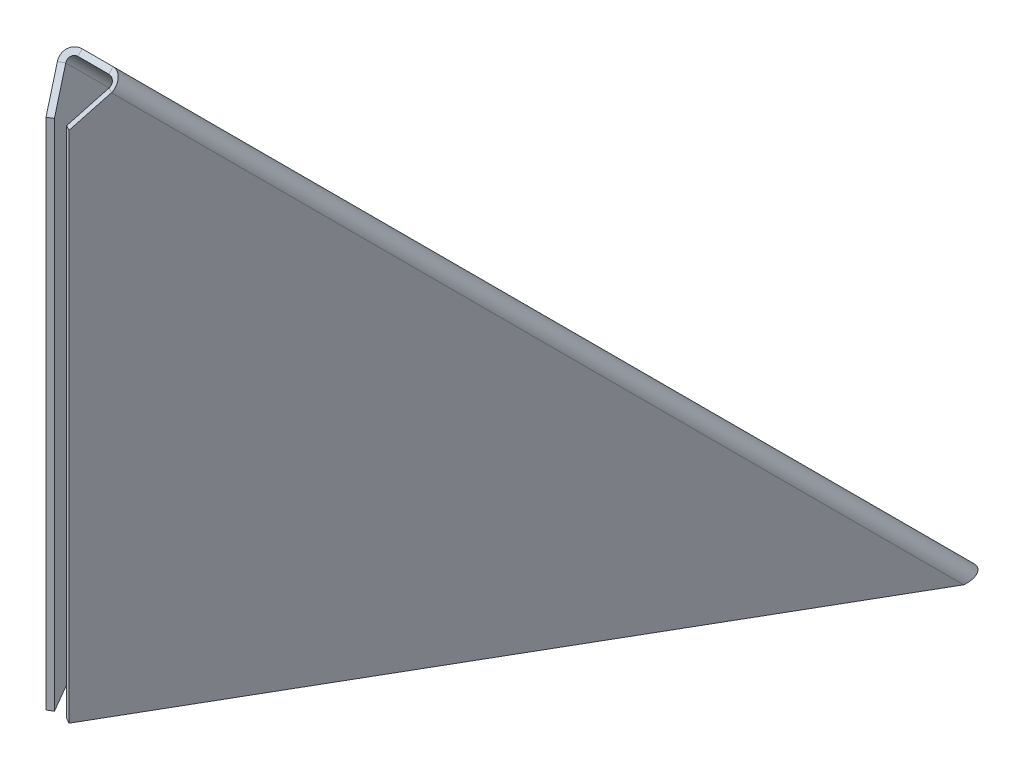
ISO-10303-21;
HEADER;
FILE_DESCRIPTION(('STEP AP214'),'2;1');
FILE_NAME('part.step','',(''),(''),'','','');
FILE_SCHEMA(('AUTOMOTIVE_DESIGN { 1 0 10303 214 1 1 1 1 }'));
ENDSEC;
DATA;
#1=APPLICATION_CONTEXT('core data for automotive mechanical design processes');
#2=APPLICATION_PROTOCOL_DEFINITION('international standard','automotive_design',2000,#1);
#3=PRODUCT_CONTEXT('',#1,'mechanical');
#4=PRODUCT('Part','Part','',(#3));
#5=PRODUCT_RELATED_PRODUCT_CATEGORY('part','',(#4));
#6=PRODUCT_DEFINITION_FORMATION('','',#4);
#7=PRODUCT_DEFINITION_CONTEXT('part definition',#1,'design');
#8=PRODUCT_DEFINITION('design','',#6,#7);
#9=PRODUCT_DEFINITION_SHAPE('','',#8);
#10=(LENGTH_UNIT() NAMED_UNIT(*) SI_UNIT(.MILLI.,.METRE.));
#11=(NAMED_UNIT(*) PLANE_ANGLE_UNIT() SI_UNIT($,.RADIAN.));
#12=(NAMED_UNIT(*) SI_UNIT($,.STERADIAN.) SOLID_ANGLE_UNIT());
#13=UNCERTAINTY_MEASURE_WITH_UNIT(LENGTH_MEASURE(1.E-05),#10,'distance_accuracy_value','');
#14=(GEOMETRIC_REPRESENTATION_CONTEXT(3) GLOBAL_UNCERTAINTY_ASSIGNED_CONTEXT((#13)) GLOBAL_UNIT_ASSIGNED_CONTEXT((#10,
#11,#12)) REPRESENTATION_CONTEXT('',''));
#15=CARTESIAN_POINT('',(0.,0.,0.));
#16=DIRECTION('',(0.,0.,1.));
#17=DIRECTION('',(1.,0.,0.));
#18=AXIS2_PLACEMENT_3D('',#15,#16,#17);
#19=CARTESIAN_POINT('',(0.,0.,0.));
#20=DIRECTION('',(0.,0.707106781186549,0.707106781186546));
#21=DIRECTION('',(1.,0.,0.));
#22=AXIS2_PLACEMENT_3D('',#19,#20,#21);
#23=PLANE('',#22);
#24=DIRECTION('',(0.,0.707106781186546,-0.707106781186549));
#25=VECTOR('',#24,1.);
#26=CARTESIAN_POINT('',(53.8626770133606,0.,0.));
#27=LINE('',#26,#25);
#28=CARTESIAN_POINT('',(53.8626770133606,0.,0.));
#29=VERTEX_POINT('',#28);
#30=CARTESIAN_POINT('',(53.8626770133606,0.70710678118654,-0.707106781186554));
#31=VERTEX_POINT('',#30);
#32=EDGE_CURVE('E11',#29,#31,#27,.T.);
#33=ORIENTED_EDGE('',*,*,#32,.F.);
#34=DIRECTION('',(1.,0.,0.));
#35=VECTOR('',#34,1.);
#36=CARTESIAN_POINT('',(0.,0.,0.));
#37=LINE('',#36,#35);
#38=CARTESIAN_POINT('',(-53.8626770133606,0.,0.));
#39=VERTEX_POINT('',#38);
#40=EDGE_CURVE('E141',#39,#29,#37,.T.);
#41=ORIENTED_EDGE('',*,*,#40,.F.);
#42=DIRECTION('',(0.,0.707106781186547,-0.707106781186547));
#43=VECTOR('',#42,1.);
#44=CARTESIAN_POINT('',(-53.8626770133606,0.,0.));
#45=LINE('',#44,#43);
#46=CARTESIAN_POINT('',(-53.8626770133606,0.707106781186546,-0.707106781186549));
#47=VERTEX_POINT('',#46);
#48=EDGE_CURVE('E51',#39,#47,#45,.T.);
#49=ORIENTED_EDGE('',*,*,#48,.T.);
#50=DIRECTION('',(1.,0.,0.));
#51=VECTOR('',#50,1.);
#52=CARTESIAN_POINT('',(0.,0.707106781186546,-0.707106781186549));
#53=LINE('',#52,#51);
#54=EDGE_CURVE('E138',#47,#31,#53,.T.);
#55=ORIENTED_EDGE('',*,*,#54,.T.);
#56=EDGE_LOOP('',(#33,#41,#49,#55));
#57=FACE_BOUND('',#56,.T.);
#58=ADVANCED_FACE('F39',(#57),#23,.F.);
#59=CARTESIAN_POINT('',(-54.2181913387227,0.,0.0913379068407981));
#60=CARTESIAN_POINT('',(-54.3273002838407,0.251976315339486,-0.0976443296638165));
#61=CARTESIAN_POINT('',(-54.4364092289587,0.50395263067897,-0.286626566168431));
#62=CARTESIAN_POINT('',(-54.5455181740767,0.755928946018455,-0.475608802673046));
#63=CARTESIAN_POINT('',(-55.9502421462916,0.,1.09133790684079));
#64=CARTESIAN_POINT('',(-56.6367013605992,0.251976315339486,1.23568900366951));
#65=CARTESIAN_POINT('',(-57.3231605749069,0.503952630678971,1.38004010049823));
#66=CARTESIAN_POINT('',(-58.0096197892145,0.755928946018456,1.52439119732694));
#67=CARTESIAN_POINT('',(-54.4227169146397,0.,3.73708921790538));
#68=CARTESIAN_POINT('',(-54.8909582387113,-0.251976315339482,4.25940478774333));
#69=CARTESIAN_POINT('',(-55.3591995627829,-0.503952630678966,4.78172035758127));
#70=CARTESIAN_POINT('',(-55.8274408868546,-0.75592894601845,5.30403592741922));
#71=CARTESIAN_POINT('',(-52.6906661070708,0.,2.73708921790539));
#72=CARTESIAN_POINT('',(-52.5815571619528,-0.251976315339483,2.92607145441));
#73=CARTESIAN_POINT('',(-52.4724482168348,-0.503952630678967,3.11505369091461));
#74=CARTESIAN_POINT('',(-52.3633392717168,-0.755928946018451,3.30403592741923));
#75=CARTESIAN_POINT('',(-50.9586152995019,0.,1.73708921790539));
#76=CARTESIAN_POINT('',(-50.2721560851943,-0.251976315339483,1.59273812107667));
#77=CARTESIAN_POINT('',(-49.5856968708867,-0.503952630678968,1.44838702424796));
#78=CARTESIAN_POINT('',(-48.8992376565791,-0.755928946018453,1.30403592741924));
#79=CARTESIAN_POINT('',(-52.4861405311539,0.,-0.908662093159197));
#80=CARTESIAN_POINT('',(-52.0178992070822,0.251976315339486,-1.43097766299714));
#81=CARTESIAN_POINT('',(-51.5496578830106,0.50395263067897,-1.95329323283509));
#82=CARTESIAN_POINT('',(-51.081416558939,0.755928946018454,-2.47560880267303));
#83=CARTESIAN_POINT('',(-54.2181913387227,0.,0.0913379068407981));
#84=CARTESIAN_POINT('',(-54.3273002838407,0.251976315339486,-0.0976443296638165));
#85=CARTESIAN_POINT('',(-54.4364092289587,0.50395263067897,-0.286626566168431));
#86=CARTESIAN_POINT('',(-54.5455181740767,0.755928946018455,-0.475608802673046));
#87=(BOUNDED_SURFACE() B_SPLINE_SURFACE(3,3,((#59,#60,#61,#62),(#63,#64,#65,#66),(#67,#68,#69,
#70),(#71,#72,#73,#74),(#75,#76,#77,#78),(#79,#80,#81,#82),(#83,#84,#85,#86)),.UNSPECIFIED.,.T.,
.F.,.F.) B_SPLINE_SURFACE_WITH_KNOTS((4,3,4),(4,4),(0.,0.5,1.),(0.,1.),
.UNSPECIFIED.) GEOMETRIC_REPRESENTATION_ITEM() RATIONAL_B_SPLINE_SURFACE(((1.,1.,1.,1.),
(0.333333333333333,0.333333333333333,0.333333333333333,0.333333333333333),(0.333333333333333,
0.333333333333333,0.333333333333333,0.333333333333333),(1.,1.,1.,1.),(0.333333333333333,
0.333333333333333,0.333333333333333,0.333333333333333),(0.333333333333333,0.333333333333333,
0.333333333333333,0.333333333333333),(1.,1.,1.,1.))) REPRESENTATION_ITEM('') SURFACE());
#88=CARTESIAN_POINT('',(-53.4544287228968,0.,1.41421356237309));
#89=DIRECTION('',(0.,1.,0.));
#90=DIRECTION('',(-0.499999999999998,0.,-0.86602540378444));
#91=AXIS2_PLACEMENT_3D('',#88,#89,#90);
#92=ELLIPSE('',#91,1.52752523165194,1.);
#93=CARTESIAN_POINT('',(-54.3204541266812,0.,1.91421356237308));
#94=VERTEX_POINT('',#93);
#95=EDGE_CURVE('E205',#39,#94,#92,.T.);
#96=DIRECTION('',(-0.86602540378444,0.,0.499999999999998));
#97=VECTOR('',#96,1.);
#98=CARTESIAN_POINT('',(-54.3204541266812,0.,1.91421356237308));
#99=LINE('',#98,#97);
#100=CARTESIAN_POINT('',(-55.1864795304657,0.,2.41421356237307));
#101=VERTEX_POINT('',#100);
#102=EDGE_CURVE('E146',#94,#101,#99,.T.);
#103=CARTESIAN_POINT('',(-53.4544287228968,0.,1.41421356237309));
#104=DIRECTION('',(0.163663417676993,0.944911182523068,0.283473354756921));
#105=DIRECTION('',(-0.472455591261531,0.327326835353988,-0.818317088384973));
#106=AXIS2_PLACEMENT_3D('',#103,#104,#105);
#107=ELLIPSE('',#106,2.3094010767585,2.);
#108=EDGE_CURVE('E160',#47,#101,#107,.T.);
#109=ORIENTED_EDGE('',*,*,#48,.F.);
#110=ORIENTED_EDGE('',*,*,#95,.T.);
#111=ORIENTED_EDGE('',*,*,#102,.T.);
#112=ORIENTED_EDGE('',*,*,#108,.F.);
#113=EDGE_LOOP('',(#109,#110,#111,#112));
#114=FACE_BOUND('',#113,.T.);
#115=ADVANCED_FACE('F161',(#114),#87,.T.);
#116=CARTESIAN_POINT('',(0.,0.,96.));
#117=DIRECTION('',(0.,1.,0.));
#118=DIRECTION('',(0.499999999999998,0.,0.86602540378444));
#119=AXIS2_PLACEMENT_3D('',#116,#117,#118);
#120=PLANE('',#119);
#121=ORIENTED_EDGE('',*,*,#102,.F.);
#122=DIRECTION('',(0.499999999999998,0.,0.86602540378444));
#123=VECTOR('',#122,1.);
#124=CARTESIAN_POINT('',(0.,0.,96.));
#125=LINE('',#124,#123);
#126=CARTESIAN_POINT('',(-0.999999999999983,0.,94.2679491924311));
#127=VERTEX_POINT('',#126);
#128=EDGE_CURVE('E210',#94,#127,#125,.T.);
#129=ORIENTED_EDGE('',*,*,#128,.T.);
#130=DIRECTION('',(-0.86602540378444,0.,0.499999999999998));
#131=VECTOR('',#130,1.);
#132=CARTESIAN_POINT('',(-0.999999999999983,0.,94.2679491924311));
#133=LINE('',#132,#131);
#134=CARTESIAN_POINT('',(-1.86602540378442,-1.11022302462516E-13,94.7679491924311));
#135=VERTEX_POINT('',#134);
#136=EDGE_CURVE('E255',#127,#135,#133,.T.);
#137=ORIENTED_EDGE('',*,*,#136,.T.);
#138=DIRECTION('',(-0.499999999999998,0.,-0.86602540378444));
#139=VECTOR('',#138,1.);
#140=CARTESIAN_POINT('',(-0.866025403784423,-1.11022302462516E-13,96.5));
#141=LINE('',#140,#139);
#142=EDGE_CURVE('E188',#101,#135,#141,.F.);
#143=ORIENTED_EDGE('',*,*,#142,.F.);
#144=EDGE_LOOP('',(#121,#129,#137,#143));
#145=FACE_BOUND('',#144,.T.);
#146=ADVANCED_FACE('F258',(#145),#120,.F.);
#147=CARTESIAN_POINT('',(-0.999999999999983,225.013062293819,94.2679491924311));
#148=DIRECTION('',(-0.499999999999998,0.,-0.86602540378444));
#149=DIRECTION('',(0.,1.,0.));
#150=AXIS2_PLACEMENT_3D('',#147,#148,#149);
#151=PLANE('',#150);
#152=ORIENTED_EDGE('',*,*,#136,.F.);
#153=DIRECTION('',(0.,1.,0.));
#154=VECTOR('',#153,1.);
#155=CARTESIAN_POINT('',(-0.999999999999983,225.013062293819,94.2679491924311));
#156=LINE('',#155,#154);
#157=CARTESIAN_POINT('',(-0.99999999999999,83.5899151838382,94.2679491924311));
#158=VERTEX_POINT('',#157);
#159=EDGE_CURVE('E221',#127,#158,#156,.T.);
#160=ORIENTED_EDGE('',*,*,#159,.T.);
#161=DIRECTION('',(-0.86602540378444,0.,0.499999999999998));
#162=VECTOR('',#161,1.);
#163=CARTESIAN_POINT('',(-0.99999999999999,83.5899151838382,94.2679491924311));
#164=LINE('',#163,#162);
#165=CARTESIAN_POINT('',(-1.86602540378443,83.5899151838382,94.7679491924311));
#166=VERTEX_POINT('',#165);
#167=EDGE_CURVE('E253',#158,#166,#164,.T.);
#168=ORIENTED_EDGE('',*,*,#167,.T.);
#169=DIRECTION('',(0.,1.,0.));
#170=VECTOR('',#169,1.);
#171=CARTESIAN_POINT('',(-1.86602540378442,225.013062293819,94.7679491924311));
#172=LINE('',#171,#170);
#173=EDGE_CURVE('E172',#135,#166,#172,.T.);
#174=ORIENTED_EDGE('',*,*,#173,.F.);
#175=EDGE_LOOP('',(#152,#160,#168,#174));
#176=FACE_BOUND('',#175,.T.);
#177=ADVANCED_FACE('F266',(#176),#151,.F.);
#178=CARTESIAN_POINT('',(19.6718516136796,47.7852179024205,130.072646473849));
#179=DIRECTION('',(0.327326835353987,0.755928946018455,0.566946709513841));
#180=DIRECTION('',(0.377964473009226,-0.654653670707977,0.654653670707979));
#181=AXIS2_PLACEMENT_3D('',#178,#179,#180);
#182=PLANE('',#181);
#183=ORIENTED_EDGE('',*,*,#167,.F.);
#184=DIRECTION('',(0.377964473009226,-0.654653670707977,0.654653670707979));
#185=VECTOR('',#184,1.);
#186=CARTESIAN_POINT('',(19.6718516136796,47.7852179024205,130.072646473849));
#187=LINE('',#186,#185);
#188=CARTESIAN_POINT('',(-3.52989704687734,87.9718254069483,89.886038969321));
#189=VERTEX_POINT('',#188);
#190=EDGE_CURVE('E207',#189,#158,#187,.T.);
#191=ORIENTED_EDGE('',*,*,#190,.F.);
#192=DIRECTION('',(-0.866025403784453,0.,0.499999999999975));
#193=VECTOR('',#192,1.);
#194=CARTESIAN_POINT('',(-3.52989704687734,87.9718254069483,89.886038969321));
#195=LINE('',#194,#193);
#196=CARTESIAN_POINT('',(-4.39592245066177,87.9718254069482,90.386038969321));
#197=VERTEX_POINT('',#196);
#198=EDGE_CURVE('E251',#189,#197,#195,.T.);
#199=ORIENTED_EDGE('',*,*,#198,.T.);
#200=DIRECTION('',(0.377964473009226,-0.654653670707977,0.654653670707979));
#201=VECTOR('',#200,1.);
#202=CARTESIAN_POINT('',(18.8058262098951,47.7852179024205,130.572646473849));
#203=LINE('',#202,#201);
#204=EDGE_CURVE('E156',#197,#166,#203,.T.);
#205=ORIENTED_EDGE('',*,*,#204,.T.);
#206=EDGE_LOOP('',(#183,#191,#199,#205));
#207=FACE_BOUND('',#206,.T.);
#208=ADVANCED_FACE('F269',(#207),#182,.T.);
#209=CARTESIAN_POINT('',(-4.52547762530268,88.4890866488607,89.9033002112335));
#210=CARTESIAN_POINT('',(-4.21687092537849,88.3999995682232,89.814213130596));
#211=CARTESIAN_POINT('',(-3.90826422545431,88.3109124875857,89.7251260499585));
#212=CARTESIAN_POINT('',(-3.59965752553012,88.2218254069483,89.636038969321));
#213=CARTESIAN_POINT('',(-4.52547762530268,91.3175137736069,87.0748730864873));
#214=CARTESIAN_POINT('',(-4.21687092537849,90.7570221721784,87.4571905266409));
#215=CARTESIAN_POINT('',(-3.90826422545431,90.1965305707499,87.8395079667944));
#216=CARTESIAN_POINT('',(-3.59965752553013,89.6360389693213,88.2218254069479));
#217=CARTESIAN_POINT('',(-0.513590526288294,90.782991289782,86.5403506026624));
#218=CARTESIAN_POINT('',(-0.822197226212478,90.4006738496285,87.100842204091));
#219=CARTESIAN_POINT('',(-1.13080392613666,90.0183564094749,87.6613338055195));
#220=CARTESIAN_POINT('',(-1.43941062606084,89.6360389693213,88.2218254069479));
#221=CARTESIAN_POINT('',(-0.513590526288294,87.9545641650358,89.3687777274086));
#222=CARTESIAN_POINT('',(-0.822197226212477,88.0436512456733,89.4578648080461));
#223=CARTESIAN_POINT('',(-1.13080392613666,88.1327383263108,89.5469518886836));
#224=CARTESIAN_POINT('',(-1.43941062606085,88.2218254069483,89.636038969321));
#225=CARTESIAN_POINT('',(-0.513590526288293,85.1261370402896,92.1972048521548));
#226=CARTESIAN_POINT('',(-0.822197226212478,85.6866286417182,91.8148874120013));
#227=CARTESIAN_POINT('',(-1.13080392613666,86.2471202431467,91.4325699718477));
#228=CARTESIAN_POINT('',(-1.43941062606085,86.8076118445752,91.0502525316941));
#229=CARTESIAN_POINT('',(-4.52547762530267,85.6606595241145,92.7317273359797));
#230=CARTESIAN_POINT('',(-4.21687092537849,86.0429769642681,92.1712357345512));
#231=CARTESIAN_POINT('',(-3.90826422545431,86.4252944044216,91.6107441331227));
#232=CARTESIAN_POINT('',(-3.59965752553013,86.8076118445752,91.0502525316941));
#233=CARTESIAN_POINT('',(-4.52547762530268,88.4890866488607,89.9033002112335));
#234=CARTESIAN_POINT('',(-4.21687092537849,88.3999995682232,89.814213130596));
#235=CARTESIAN_POINT('',(-3.90826422545431,88.3109124875857,89.7251260499585));
#236=CARTESIAN_POINT('',(-3.59965752553012,88.2218254069483,89.636038969321));
#237=(BOUNDED_SURFACE() B_SPLINE_SURFACE(3,3,((#209,#210,#211,#212),(#213,#214,#215,#216),(#217,
#218,#219,#220),(#221,#222,#223,#224),(#225,#226,#227,#228),(#229,#230,#231,#232),(#233,#234,
#235,#236)),.UNSPECIFIED.,.T.,.F.,.F.) B_SPLINE_SURFACE_WITH_KNOTS((4,3,4),(4,4),(0.,0.5,1.),
(0.,1.),.UNSPECIFIED.) GEOMETRIC_REPRESENTATION_ITEM() RATIONAL_B_SPLINE_SURFACE(((1.,1.,1.,1.),
(0.333333333333333,0.333333333333333,0.333333333333333,0.333333333333333),(0.333333333333333,
0.333333333333333,0.333333333333333,0.333333333333333),(1.,1.,1.,1.),(0.333333333333333,
0.333333333333333,0.333333333333333,0.333333333333333),(0.333333333333333,0.333333333333333,
0.333333333333333,0.333333333333333),(1.,1.,1.,1.))) REPRESENTATION_ITEM('') SURFACE());
#238=CARTESIAN_POINT('',(-2.51953407579548,88.2218254069483,89.636038969321));
#239=DIRECTION('',(0.,0.707106781186549,0.707106781186546));
#240=DIRECTION('',(-1.,0.,0.));
#241=AXIS2_PLACEMENT_3D('',#238,#239,#240);
#242=ELLIPSE('',#241,1.08012344973464,1.);
#243=CARTESIAN_POINT('',(-2.51953407579548,88.9289321881348,88.9289321881345));
#244=VERTEX_POINT('',#243);
#245=EDGE_CURVE('E231',#189,#244,#242,.F.);
#246=DIRECTION('',(0.,0.707106781186546,-0.707106781186549));
#247=VECTOR('',#246,1.);
#248=CARTESIAN_POINT('',(-2.51953407579548,88.9289321881348,88.9289321881345));
#249=LINE('',#248,#247);
#250=CARTESIAN_POINT('',(-2.51953407579548,89.6360389693214,88.221825406948));
#251=VERTEX_POINT('',#250);
#252=EDGE_CURVE('E249',#244,#251,#249,.T.);
#253=CARTESIAN_POINT('',(-2.51953407579548,88.2218254069483,89.636038969321));
#254=DIRECTION('',(0.185164019954511,0.694879228972304,0.694879228972302));
#255=DIRECTION('',(-0.982707629823991,0.130930734141596,0.130930734141596));
#256=AXIS2_PLACEMENT_3D('',#253,#254,#255);
#257=ELLIPSE('',#256,2.04124145231931,2.);
#258=EDGE_CURVE('E165',#197,#251,#257,.F.);
#259=ORIENTED_EDGE('',*,*,#198,.F.);
#260=ORIENTED_EDGE('',*,*,#245,.T.);
#261=ORIENTED_EDGE('',*,*,#252,.T.);
#262=ORIENTED_EDGE('',*,*,#258,.F.);
#263=EDGE_LOOP('',(#259,#260,#261,#262));
#264=FACE_BOUND('',#263,.T.);
#265=ADVANCED_FACE('F271',(#264),#237,.F.);
#266=CARTESIAN_POINT('',(-4.08248290463858,88.9289321881348,88.9289321881345));
#267=DIRECTION('',(0.,-0.707106781186549,-0.707106781186546));
#268=DIRECTION('',(-1.,0.,0.));
#269=AXIS2_PLACEMENT_3D('',#266,#267,#268);
#270=PLANE('',#269);
#271=ORIENTED_EDGE('',*,*,#252,.F.);
#272=DIRECTION('',(-1.,0.,0.));
#273=VECTOR('',#272,1.);
#274=CARTESIAN_POINT('',(-4.08248290463858,88.9289321881348,88.9289321881345));
#275=LINE('',#274,#273);
#276=CARTESIAN_POINT('',(2.5195340757955,88.9289321881348,88.9289321881345));
#277=VERTEX_POINT('',#276);
#278=EDGE_CURVE('E202',#277,#244,#275,.T.);
#279=ORIENTED_EDGE('',*,*,#278,.F.);
#280=DIRECTION('',(0.,0.707106781186513,-0.707106781186582));
#281=VECTOR('',#280,1.);
#282=CARTESIAN_POINT('',(2.5195340757955,88.9289321881348,88.9289321881345));
#283=LINE('',#282,#281);
#284=CARTESIAN_POINT('',(2.5195340757955,89.6360389693214,88.221825406948));
#285=VERTEX_POINT('',#284);
#286=EDGE_CURVE('E247',#277,#285,#283,.T.);
#287=ORIENTED_EDGE('',*,*,#286,.T.);
#288=DIRECTION('',(1.,0.,0.));
#289=VECTOR('',#288,1.);
#290=CARTESIAN_POINT('',(0.,89.6360389693214,88.221825406948));
#291=LINE('',#290,#289);
#292=EDGE_CURVE('E157',#285,#251,#291,.F.);
#293=ORIENTED_EDGE('',*,*,#292,.T.);
#294=EDGE_LOOP('',(#271,#279,#287,#293));
#295=FACE_BOUND('',#294,.T.);
#296=ADVANCED_FACE('F276',(#295),#270,.F.);
#297=CARTESIAN_POINT('',(0.513590526288311,87.9545641650358,89.3687777274086));
#298=CARTESIAN_POINT('',(0.822197226212496,88.0436512456733,89.4578648080461));
#299=CARTESIAN_POINT('',(1.13080392613668,88.1327383263108,89.5469518886836));
#300=CARTESIAN_POINT('',(1.43941062606086,88.2218254069482,89.636038969321));
#301=CARTESIAN_POINT('',(0.513590526288303,90.782991289782,86.5403506026624));
#302=CARTESIAN_POINT('',(0.82219722621249,90.4006738496285,87.100842204091));
#303=CARTESIAN_POINT('',(1.13080392613668,90.0183564094749,87.6613338055195));
#304=CARTESIAN_POINT('',(1.43941062606086,89.6360389693213,88.2218254069479));
#305=CARTESIAN_POINT('',(4.52547762530269,91.3175137736068,87.0748730864873));
#306=CARTESIAN_POINT('',(4.21687092537851,90.7570221721784,87.4571905266409));
#307=CARTESIAN_POINT('',(3.90826422545433,90.1965305707499,87.8395079667944));
#308=CARTESIAN_POINT('',(3.59965752553015,89.6360389693213,88.2218254069479));
#309=CARTESIAN_POINT('',(4.5254776253027,88.4890866488607,89.9033002112335));
#310=CARTESIAN_POINT('',(4.21687092537852,88.3999995682232,89.814213130596));
#311=CARTESIAN_POINT('',(3.90826422545433,88.3109124875857,89.7251260499585));
#312=CARTESIAN_POINT('',(3.59965752553015,88.2218254069482,89.636038969321));
#313=CARTESIAN_POINT('',(4.52547762530271,85.6606595241145,92.7317273359797));
#314=CARTESIAN_POINT('',(4.21687092537852,86.0429769642681,92.1712357345512));
#315=CARTESIAN_POINT('',(3.90826422545434,86.4252944044216,91.6107441331227));
#316=CARTESIAN_POINT('',(3.59965752553015,86.8076118445751,91.0502525316941));
#317=CARTESIAN_POINT('',(0.51359052628832,85.1261370402896,92.1972048521548));
#318=CARTESIAN_POINT('',(0.822197226212502,85.6866286417182,91.8148874120013));
#319=CARTESIAN_POINT('',(1.13080392613668,86.2471202431467,91.4325699718477));
#320=CARTESIAN_POINT('',(1.43941062606086,86.8076118445751,91.0502525316941));
#321=CARTESIAN_POINT('',(0.513590526288311,87.9545641650358,89.3687777274086));
#322=CARTESIAN_POINT('',(0.822197226212496,88.0436512456733,89.4578648080461));
#323=CARTESIAN_POINT('',(1.13080392613668,88.1327383263108,89.5469518886836));
#324=CARTESIAN_POINT('',(1.43941062606086,88.2218254069482,89.636038969321));
#325=(BOUNDED_SURFACE() B_SPLINE_SURFACE(3,3,((#297,#298,#299,#300),(#301,#302,#303,#304),(#305,
#306,#307,#308),(#309,#310,#311,#312),(#313,#314,#315,#316),(#317,#318,#319,#320),(#321,#322,
#323,#324)),.UNSPECIFIED.,.T.,.F.,.F.) B_SPLINE_SURFACE_WITH_KNOTS((4,3,4),(4,4),(0.,0.5,1.),
(0.,1.),.UNSPECIFIED.) GEOMETRIC_REPRESENTATION_ITEM() RATIONAL_B_SPLINE_SURFACE(((1.,1.,1.,1.),
(0.333333333333333,0.333333333333333,0.333333333333333,0.333333333333333),(0.333333333333333,
0.333333333333333,0.333333333333333,0.333333333333333),(1.,1.,1.,1.),(0.333333333333333,
0.333333333333333,0.333333333333333,0.333333333333333),(0.333333333333333,0.333333333333333,
0.333333333333333,0.333333333333333),(1.,1.,1.,1.))) REPRESENTATION_ITEM('') SURFACE());
#326=CARTESIAN_POINT('',(2.51953407579551,88.2218254069482,89.636038969321));
#327=DIRECTION('',(0.,0.707106781186549,0.707106781186546));
#328=DIRECTION('',(-1.,0.,0.));
#329=AXIS2_PLACEMENT_3D('',#326,#327,#328);
#330=ELLIPSE('',#329,1.08012344973464,1.);
#331=CARTESIAN_POINT('',(3.52989704687736,87.9718254069483,89.886038969321));
#332=VERTEX_POINT('',#331);
#333=EDGE_CURVE('E234',#277,#332,#330,.F.);
#334=DIRECTION('',(0.86602540378444,0.,0.499999999999998));
#335=VECTOR('',#334,1.);
#336=CARTESIAN_POINT('',(3.52989704687736,87.9718254069483,89.886038969321));
#337=LINE('',#336,#335);
#338=CARTESIAN_POINT('',(4.39592245066177,87.9718254069483,90.386038969321));
#339=VERTEX_POINT('',#338);
#340=EDGE_CURVE('E101',#332,#339,#337,.T.);
#341=CARTESIAN_POINT('',(2.51953407579551,88.2218254069482,89.636038969321));
#342=DIRECTION('',(-0.185164019954509,0.694879228972305,0.694879228972302));
#343=DIRECTION('',(-0.982707629823991,-0.130930734141596,-0.130930734141593));
#344=AXIS2_PLACEMENT_3D('',#341,#342,#343);
#345=ELLIPSE('',#344,2.04124145231931,2.);
#346=EDGE_CURVE('E189',#285,#339,#345,.F.);
#347=ORIENTED_EDGE('',*,*,#286,.F.);
#348=ORIENTED_EDGE('',*,*,#333,.T.);
#349=ORIENTED_EDGE('',*,*,#340,.T.);
#350=ORIENTED_EDGE('',*,*,#346,.F.);
#351=EDGE_LOOP('',(#347,#348,#349,#350));
#352=FACE_BOUND('',#351,.T.);
#353=ADVANCED_FACE('F288',(#352),#325,.F.);
#354=CARTESIAN_POINT('',(-20.8382753007191,45.7649128133161,132.092951562953));
#355=DIRECTION('',(-0.327326835353987,0.755928946018455,0.566946709513841));
#356=DIRECTION('',(0.377964473009226,0.654653670707977,-0.654653670707979));
#357=AXIS2_PLACEMENT_3D('',#354,#355,#356);
#358=PLANE('',#357);
#359=ORIENTED_EDGE('',*,*,#340,.F.);
#360=DIRECTION('',(0.377964473009226,0.654653670707977,-0.654653670707979));
#361=VECTOR('',#360,1.);
#362=CARTESIAN_POINT('',(-20.8382753007191,45.7649128133161,132.092951562953));
#363=LINE('',#362,#361);
#364=CARTESIAN_POINT('',(1.00000000000002,83.5899151838382,94.2679491924311));
#365=VERTEX_POINT('',#364);
#366=EDGE_CURVE('E213',#365,#332,#363,.T.);
#367=ORIENTED_EDGE('',*,*,#366,.F.);
#368=DIRECTION('',(0.86602540378444,0.,0.499999999999998));
#369=VECTOR('',#368,1.);
#370=CARTESIAN_POINT('',(1.00000000000002,83.5899151838382,94.2679491924311));
#371=LINE('',#370,#369);
#372=CARTESIAN_POINT('',(1.86602540378446,83.5899151838382,94.7679491924311));
#373=VERTEX_POINT('',#372);
#374=EDGE_CURVE('E111',#365,#373,#371,.T.);
#375=ORIENTED_EDGE('',*,*,#374,.T.);
#376=DIRECTION('',(0.377964473009226,0.654653670707977,-0.654653670707979));
#377=VECTOR('',#376,1.);
#378=CARTESIAN_POINT('',(-19.9722498969347,45.7649128133161,132.592951562953));
#379=LINE('',#378,#377);
#380=EDGE_CURVE('E184',#373,#339,#379,.T.);
#381=ORIENTED_EDGE('',*,*,#380,.T.);
#382=EDGE_LOOP('',(#359,#367,#375,#381));
#383=FACE_BOUND('',#382,.T.);
#384=ADVANCED_FACE('F306',(#383),#358,.T.);
#385=CARTESIAN_POINT('',(1.00000000000001,225.013062293819,94.2679491924311));
#386=DIRECTION('',(0.499999999999998,0.,-0.86602540378444));
#387=DIRECTION('',(0.,-1.,0.));
#388=AXIS2_PLACEMENT_3D('',#385,#386,#387);
#389=PLANE('',#388);
#390=ORIENTED_EDGE('',*,*,#374,.F.);
#391=DIRECTION('',(0.,-1.,0.));
#392=VECTOR('',#391,1.);
#393=CARTESIAN_POINT('',(1.00000000000001,225.013062293819,94.2679491924311));
#394=LINE('',#393,#392);
#395=CARTESIAN_POINT('',(1.00000000000003,0.,94.2679491924311));
#396=VERTEX_POINT('',#395);
#397=EDGE_CURVE('E218',#365,#396,#394,.T.);
#398=ORIENTED_EDGE('',*,*,#397,.T.);
#399=DIRECTION('',(0.86602540378444,0.,0.499999999999998));
#400=VECTOR('',#399,1.);
#401=CARTESIAN_POINT('',(1.00000000000003,0.,94.2679491924311));
#402=LINE('',#401,#400);
#403=CARTESIAN_POINT('',(1.86602540378447,0.,94.7679491924311));
#404=VERTEX_POINT('',#403);
#405=EDGE_CURVE('E243',#396,#404,#402,.T.);
#406=ORIENTED_EDGE('',*,*,#405,.T.);
#407=DIRECTION('',(0.,1.,0.));
#408=VECTOR('',#407,1.);
#409=CARTESIAN_POINT('',(1.86602540378446,225.013062293819,94.7679491924311));
#410=LINE('',#409,#408);
#411=EDGE_CURVE('E177',#373,#404,#410,.F.);
#412=ORIENTED_EDGE('',*,*,#411,.F.);
#413=EDGE_LOOP('',(#390,#398,#406,#412));
#414=FACE_BOUND('',#413,.T.);
#415=ADVANCED_FACE('F304',(#414),#389,.F.);
#416=CARTESIAN_POINT('',(55.4256258422037,0.,0.));
#417=DIRECTION('',(0.,1.,0.));
#418=DIRECTION('',(0.499999999999998,0.,-0.86602540378444));
#419=AXIS2_PLACEMENT_3D('',#416,#417,#418);
#420=PLANE('',#419);
#421=ORIENTED_EDGE('',*,*,#405,.F.);
#422=DIRECTION('',(0.499999999999998,0.,-0.86602540378444));
#423=VECTOR('',#422,1.);
#424=CARTESIAN_POINT('',(55.4256258422037,0.,0.));
#425=LINE('',#424,#423);
#426=CARTESIAN_POINT('',(54.3204541266812,0.,1.9142135623731));
#427=VERTEX_POINT('',#426);
#428=EDGE_CURVE('E216',#396,#427,#425,.T.);
#429=ORIENTED_EDGE('',*,*,#428,.T.);
#430=DIRECTION('',(0.866025403784435,0.,0.500000000000005));
#431=VECTOR('',#430,1.);
#432=CARTESIAN_POINT('',(54.3204541266812,0.,1.9142135623731));
#433=LINE('',#432,#431);
#434=CARTESIAN_POINT('',(55.1864795304657,0.,2.41421356237309));
#435=VERTEX_POINT('',#434);
#436=EDGE_CURVE('E45',#427,#435,#433,.T.);
#437=ORIENTED_EDGE('',*,*,#436,.T.);
#438=DIRECTION('',(-0.499999999999998,0.,0.86602540378444));
#439=VECTOR('',#438,1.);
#440=CARTESIAN_POINT('',(56.2916512459882,0.,0.500000000000001));
#441=LINE('',#440,#439);
#442=EDGE_CURVE('E182',#404,#435,#441,.F.);
#443=ORIENTED_EDGE('',*,*,#442,.F.);
#444=EDGE_LOOP('',(#421,#429,#437,#443));
#445=FACE_BOUND('',#444,.T.);
#446=ADVANCED_FACE('F299',(#445),#420,.F.);
#447=CARTESIAN_POINT('',(52.6906661070708,0.,2.73708921790539));
#448=CARTESIAN_POINT('',(52.5815571619528,-0.251976315339484,2.92607145441));
#449=CARTESIAN_POINT('',(52.4724482168348,-0.503952630678969,3.11505369091462));
#450=CARTESIAN_POINT('',(52.3633392717168,-0.755928946018453,3.30403592741923));
#451=CARTESIAN_POINT('',(54.4227169146397,0.,3.73708921790538));
#452=CARTESIAN_POINT('',(54.8909582387113,-0.251976315339484,4.25940478774333));
#453=CARTESIAN_POINT('',(55.359199562783,-0.503952630678968,4.78172035758128));
#454=CARTESIAN_POINT('',(55.8274408868546,-0.755928946018452,5.30403592741922));
#455=CARTESIAN_POINT('',(55.9502421462916,0.,1.0913379068408));
#456=CARTESIAN_POINT('',(56.6367013605993,0.251976315339485,1.23568900366951));
#457=CARTESIAN_POINT('',(57.3231605749069,0.503952630678969,1.38004010049823));
#458=CARTESIAN_POINT('',(58.0096197892145,0.755928946018454,1.52439119732695));
#459=CARTESIAN_POINT('',(54.2181913387227,0.,0.0913379068407999));
#460=CARTESIAN_POINT('',(54.3273002838407,0.251976315339484,-0.0976443296638147));
#461=CARTESIAN_POINT('',(54.4364092289587,0.503952630678969,-0.286626566168429));
#462=CARTESIAN_POINT('',(54.5455181740767,0.755928946018453,-0.475608802673044));
#463=CARTESIAN_POINT('',(52.4861405311539,0.,-0.908662093159196));
#464=CARTESIAN_POINT('',(52.0178992070822,0.251976315339484,-1.43097766299714));
#465=CARTESIAN_POINT('',(51.5496578830106,0.503952630678968,-1.95329323283509));
#466=CARTESIAN_POINT('',(51.081416558939,0.755928946018453,-2.47560880267303));
#467=CARTESIAN_POINT('',(50.9586152995019,0.,1.73708921790539));
#468=CARTESIAN_POINT('',(50.2721560851943,-0.251976315339485,1.59273812107668));
#469=CARTESIAN_POINT('',(49.5856968708867,-0.503952630678969,1.44838702424796));
#470=CARTESIAN_POINT('',(48.8992376565791,-0.755928946018454,1.30403592741924));
#471=CARTESIAN_POINT('',(52.6906661070708,0.,2.73708921790539));
#472=CARTESIAN_POINT('',(52.5815571619528,-0.251976315339484,2.92607145441));
#473=CARTESIAN_POINT('',(52.4724482168348,-0.503952630678969,3.11505369091462));
#474=CARTESIAN_POINT('',(52.3633392717168,-0.755928946018453,3.30403592741923));
#475=(BOUNDED_SURFACE() B_SPLINE_SURFACE(3,3,((#447,#448,#449,#450),(#451,#452,#453,#454),(#455,
#456,#457,#458),(#459,#460,#461,#462),(#463,#464,#465,#466),(#467,#468,#469,#470),(#471,#472,
#473,#474)),.UNSPECIFIED.,.T.,.F.,.F.) B_SPLINE_SURFACE_WITH_KNOTS((4,3,4),(4,4),(0.,0.5,1.),
(0.,1.),.UNSPECIFIED.) GEOMETRIC_REPRESENTATION_ITEM() RATIONAL_B_SPLINE_SURFACE(((1.,1.,1.,1.),
(0.333333333333333,0.333333333333333,0.333333333333333,0.333333333333333),(0.333333333333333,
0.333333333333333,0.333333333333333,0.333333333333333),(1.,1.,1.,1.),(0.333333333333333,
0.333333333333333,0.333333333333333,0.333333333333333),(0.333333333333333,0.333333333333333,
0.333333333333333,0.333333333333333),(1.,1.,1.,1.))) REPRESENTATION_ITEM('') SURFACE());
#476=CARTESIAN_POINT('',(53.4544287228968,0.,1.41421356237309));
#477=DIRECTION('',(0.,1.,0.));
#478=DIRECTION('',(-0.499999999999998,0.,0.86602540378444));
#479=AXIS2_PLACEMENT_3D('',#476,#477,#478);
#480=ELLIPSE('',#479,1.52752523165194,1.);
#481=EDGE_CURVE('E239',#427,#29,#480,.T.);
#482=CARTESIAN_POINT('',(53.4544287228968,0.,1.41421356237309));
#483=DIRECTION('',(-0.163663417676993,0.944911182523068,0.283473354756921));
#484=DIRECTION('',(-0.472455591261531,-0.327326835353988,0.818317088384973));
#485=AXIS2_PLACEMENT_3D('',#482,#483,#484);
#486=ELLIPSE('',#485,2.3094010767585,2.);
#487=EDGE_CURVE('E192',#435,#31,#486,.T.);
#488=ORIENTED_EDGE('',*,*,#481,.T.);
#489=ORIENTED_EDGE('',*,*,#32,.T.);
#490=ORIENTED_EDGE('',*,*,#487,.F.);
#491=ORIENTED_EDGE('',*,*,#436,.F.);
#492=EDGE_LOOP('',(#488,#489,#490,#491));
#493=FACE_BOUND('',#492,.T.);
#494=ADVANCED_FACE('F41',(#493),#475,.T.);
#495=CARTESIAN_POINT('',(56.2916512459882,225.013062293819,0.500000000000001));
#496=DIRECTION('',(-0.86602540378444,0.,-0.499999999999998));
#497=DIRECTION('',(-0.499999999999998,0.,0.86602540378444));
#498=AXIS2_PLACEMENT_3D('',#495,#496,#497);
#499=PLANE('',#498);
#500=ORIENTED_EDGE('',*,*,#442,.T.);
#501=DIRECTION('',(-0.377964473009225,0.654653670707979,0.654653670707977));
#502=VECTOR('',#501,1.);
#503=CARTESIAN_POINT('',(47.9000596761638,12.6204493929295,15.0346629553026));
#504=LINE('',#503,#502);
#505=EDGE_CURVE('E293',#435,#339,#504,.T.);
#506=ORIENTED_EDGE('',*,*,#505,.T.);
#507=ORIENTED_EDGE('',*,*,#380,.F.);
#508=ORIENTED_EDGE('',*,*,#411,.T.);
#509=EDGE_LOOP('',(#500,#506,#507,#508));
#510=FACE_BOUND('',#509,.T.);
#511=ADVANCED_FACE('F296',(#510),#499,.F.);
#512=CARTESIAN_POINT('',(-0.866025403784423,225.013062293819,96.5));
#513=DIRECTION('',(0.86602540378444,0.,-0.499999999999998));
#514=DIRECTION('',(-0.499999999999998,0.,-0.86602540378444));
#515=AXIS2_PLACEMENT_3D('',#512,#513,#514);
#516=PLANE('',#515);
#517=ORIENTED_EDGE('',*,*,#204,.F.);
#518=DIRECTION('',(-0.377964473009225,-0.654653670707979,-0.654653670707977));
#519=VECTOR('',#518,1.);
#520=CARTESIAN_POINT('',(-47.9000596761638,12.6204493929295,15.0346629553026));
#521=LINE('',#520,#519);
#522=EDGE_CURVE('E171',#197,#101,#521,.T.);
#523=ORIENTED_EDGE('',*,*,#522,.T.);
#524=ORIENTED_EDGE('',*,*,#142,.T.);
#525=ORIENTED_EDGE('',*,*,#173,.T.);
#526=EDGE_LOOP('',(#517,#523,#524,#525));
#527=FACE_BOUND('',#526,.T.);
#528=ADVANCED_FACE('F265',(#527),#516,.F.);
#529=CARTESIAN_POINT('',(0.,0.707106781186546,-0.707106781186549));
#530=DIRECTION('',(0.,0.707106781186546,-0.707106781186549));
#531=DIRECTION('',(0.,0.707106781186549,0.707106781186546));
#532=AXIS2_PLACEMENT_3D('',#529,#530,#531);
#533=PLANE('',#532);
#534=ORIENTED_EDGE('',*,*,#292,.F.);
#535=DIRECTION('',(-0.377964473009225,0.654653670707979,0.654653670707977));
#536=VECTOR('',#535,1.);
#537=CARTESIAN_POINT('',(46.1680088685949,14.0346629553026,12.6204493929295));
#538=LINE('',#537,#536);
#539=EDGE_CURVE('E155',#285,#31,#538,.F.);
#540=ORIENTED_EDGE('',*,*,#539,.T.);
#541=ORIENTED_EDGE('',*,*,#54,.F.);
#542=DIRECTION('',(-0.377964473009225,-0.654653670707979,-0.654653670707977));
#543=VECTOR('',#542,1.);
#544=CARTESIAN_POINT('',(-46.1680088685949,14.0346629553026,12.6204493929295));
#545=LINE('',#544,#543);
#546=EDGE_CURVE('E153',#47,#251,#545,.F.);
#547=ORIENTED_EDGE('',*,*,#546,.T.);
#548=EDGE_LOOP('',(#534,#540,#541,#547));
#549=FACE_BOUND('',#548,.T.);
#550=ADVANCED_FACE('F151',(#549),#533,.T.);
#551=CARTESIAN_POINT('',(-46.1680088685949,12.6204493929295,14.0346629553026));
#552=DIRECTION('',(-0.377964473009225,-0.654653670707979,-0.654653670707977));
#553=DIRECTION('',(0.,0.707106781186546,-0.707106781186549));
#554=AXIS2_PLACEMENT_3D('',#551,#552,#553);
#555=CYLINDRICAL_SURFACE('',#554,2.);
#556=ORIENTED_EDGE('',*,*,#108,.T.);
#557=ORIENTED_EDGE('',*,*,#522,.F.);
#558=ORIENTED_EDGE('',*,*,#258,.T.);
#559=ORIENTED_EDGE('',*,*,#546,.F.);
#560=EDGE_LOOP('',(#556,#557,#558,#559));
#561=FACE_BOUND('',#560,.T.);
#562=ADVANCED_FACE('F168',(#561),#555,.T.);
#563=CARTESIAN_POINT('',(46.1680088685949,12.6204493929295,14.0346629553026));
#564=DIRECTION('',(-0.377964473009225,0.654653670707979,0.654653670707977));
#565=DIRECTION('',(0.,-0.707106781186546,0.707106781186549));
#566=AXIS2_PLACEMENT_3D('',#563,#564,#565);
#567=CYLINDRICAL_SURFACE('',#566,2.);
#568=ORIENTED_EDGE('',*,*,#346,.T.);
#569=ORIENTED_EDGE('',*,*,#505,.F.);
#570=ORIENTED_EDGE('',*,*,#487,.T.);
#571=ORIENTED_EDGE('',*,*,#539,.F.);
#572=EDGE_LOOP('',(#568,#569,#570,#571));
#573=FACE_BOUND('',#572,.T.);
#574=ADVANCED_FACE('F292',(#573),#567,.T.);
#575=CARTESIAN_POINT('',(55.4256258422037,225.013062293819,0.));
#576=DIRECTION('',(-0.86602540378444,0.,-0.499999999999998));
#577=DIRECTION('',(-0.499999999999998,0.,0.86602540378444));
#578=AXIS2_PLACEMENT_3D('',#575,#576,#577);
#579=PLANE('',#578);
#580=ORIENTED_EDGE('',*,*,#428,.F.);
#581=ORIENTED_EDGE('',*,*,#397,.F.);
#582=ORIENTED_EDGE('',*,*,#366,.T.);
#583=DIRECTION('',(0.377964473009225,-0.654653670707979,-0.654653670707977));
#584=VECTOR('',#583,1.);
#585=CARTESIAN_POINT('',(3.60883788370037,87.8350958667788,89.7493094291516));
#586=LINE('',#585,#584);
#587=EDGE_CURVE('E201',#427,#332,#586,.F.);
#588=ORIENTED_EDGE('',*,*,#587,.F.);
#589=EDGE_LOOP('',(#580,#581,#582,#588));
#590=FACE_BOUND('',#589,.T.);
#591=ADVANCED_FACE('F302',(#590),#579,.T.);
#592=CARTESIAN_POINT('',(0.,225.013062293819,96.));
#593=DIRECTION('',(0.86602540378444,0.,-0.499999999999998));
#594=DIRECTION('',(-0.499999999999998,0.,-0.86602540378444));
#595=AXIS2_PLACEMENT_3D('',#592,#593,#594);
#596=PLANE('',#595);
#597=ORIENTED_EDGE('',*,*,#190,.T.);
#598=ORIENTED_EDGE('',*,*,#159,.F.);
#599=ORIENTED_EDGE('',*,*,#128,.F.);
#600=DIRECTION('',(0.377964473009225,0.654653670707979,0.654653670707977));
#601=VECTOR('',#600,1.);
#602=CARTESIAN_POINT('',(-54.9519808212655,-1.09383632135605,0.820377241017038));
#603=LINE('',#602,#601);
#604=EDGE_CURVE('E227',#189,#94,#603,.F.);
#605=ORIENTED_EDGE('',*,*,#604,.F.);
#606=EDGE_LOOP('',(#597,#598,#599,#605));
#607=FACE_BOUND('',#606,.T.);
#608=ADVANCED_FACE('F436',(#607),#596,.T.);
#609=CARTESIAN_POINT('',(0.,0.,0.));
#610=DIRECTION('',(0.,0.707106781186546,-0.707106781186549));
#611=DIRECTION('',(0.,0.707106781186549,0.707106781186546));
#612=AXIS2_PLACEMENT_3D('',#609,#610,#611);
#613=PLANE('',#612);
#614=ORIENTED_EDGE('',*,*,#278,.T.);
#615=DIRECTION('',(0.377964473009225,0.654653670707979,0.654653670707977));
#616=VECTOR('',#615,1.);
#617=CARTESIAN_POINT('',(-2.74281247991592,88.5422026479653,88.542202647965));
#618=LINE('',#617,#616);
#619=EDGE_CURVE('E224',#39,#244,#618,.T.);
#620=ORIENTED_EDGE('',*,*,#619,.F.);
#621=ORIENTED_EDGE('',*,*,#40,.T.);
#622=DIRECTION('',(0.377964473009225,-0.654653670707979,-0.654653670707977));
#623=VECTOR('',#622,1.);
#624=CARTESIAN_POINT('',(54.0859554174811,-0.386729540169509,-0.386729540169508));
#625=LINE('',#624,#623);
#626=EDGE_CURVE('E230',#277,#29,#625,.T.);
#627=ORIENTED_EDGE('',*,*,#626,.F.);
#628=EDGE_LOOP('',(#614,#620,#621,#627));
#629=FACE_BOUND('',#628,.T.);
#630=ADVANCED_FACE('F282',(#629),#613,.F.);
#631=CARTESIAN_POINT('',(-46.1680088685949,12.6204493929295,14.0346629553026));
#632=DIRECTION('',(-0.377964473009225,-0.654653670707979,-0.654653670707977));
#633=DIRECTION('',(0.,0.707106781186546,-0.707106781186549));
#634=AXIS2_PLACEMENT_3D('',#631,#632,#633);
#635=CYLINDRICAL_SURFACE('',#634,1.);
#636=ORIENTED_EDGE('',*,*,#95,.F.);
#637=ORIENTED_EDGE('',*,*,#619,.T.);
#638=ORIENTED_EDGE('',*,*,#245,.F.);
#639=ORIENTED_EDGE('',*,*,#604,.T.);
#640=EDGE_LOOP('',(#636,#637,#638,#639));
#641=FACE_BOUND('',#640,.T.);
#642=ADVANCED_FACE('F279',(#641),#635,.F.);
#643=CARTESIAN_POINT('',(46.1680088685949,12.6204493929295,14.0346629553026));
#644=DIRECTION('',(-0.377964473009225,0.654653670707979,0.654653670707977));
#645=DIRECTION('',(0.,-0.707106781186546,0.707106781186549));
#646=AXIS2_PLACEMENT_3D('',#643,#644,#645);
#647=CYLINDRICAL_SURFACE('',#646,1.);
#648=ORIENTED_EDGE('',*,*,#333,.F.);
#649=ORIENTED_EDGE('',*,*,#626,.T.);
#650=ORIENTED_EDGE('',*,*,#481,.F.);
#651=ORIENTED_EDGE('',*,*,#587,.T.);
#652=EDGE_LOOP('',(#648,#649,#650,#651));
#653=FACE_BOUND('',#652,.T.);
#654=ADVANCED_FACE('F286',(#653),#647,.F.);
#655=CLOSED_SHELL('',(#58,#115,#146,#177,#208,#265,#296,#353,#384,#415,#446,#494,#511,#528,#550,
#562,#574,#591,#608,#630,#642,#654));
#656=MANIFOLD_SOLID_BREP('B2',#655);
#657=ADVANCED_BREP_SHAPE_REPRESENTATION('',(#18,#656),#14);
#658=SHAPE_DEFINITION_REPRESENTATION(#9,#657);
ENDSEC;
END-ISO-10303-21;
